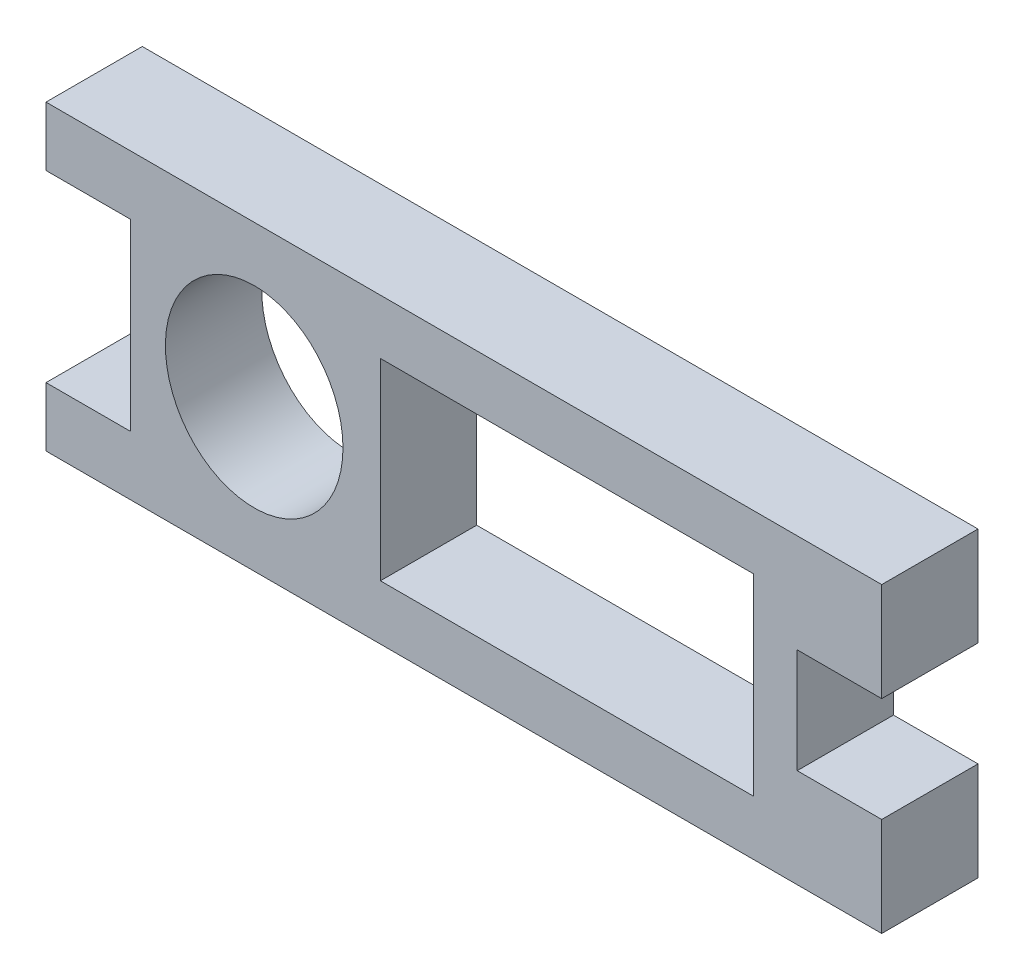
ISO-10303-21;
HEADER;
FILE_DESCRIPTION(('STEP AP214'),'2;1');
FILE_NAME('part.step','',(''),(''),'','','');
FILE_SCHEMA(('AUTOMOTIVE_DESIGN { 1 0 10303 214 1 1 1 1 }'));
ENDSEC;
DATA;
#1=APPLICATION_CONTEXT('core data for automotive mechanical design processes');
#2=APPLICATION_PROTOCOL_DEFINITION('international standard','automotive_design',2000,#1);
#3=PRODUCT_CONTEXT('',#1,'mechanical');
#4=PRODUCT('Part','Part','',(#3));
#5=PRODUCT_RELATED_PRODUCT_CATEGORY('part','',(#4));
#6=PRODUCT_DEFINITION_FORMATION('','',#4);
#7=PRODUCT_DEFINITION_CONTEXT('part definition',#1,'design');
#8=PRODUCT_DEFINITION('design','',#6,#7);
#9=PRODUCT_DEFINITION_SHAPE('','',#8);
#10=(LENGTH_UNIT() NAMED_UNIT(*) SI_UNIT(.MILLI.,.METRE.));
#11=(NAMED_UNIT(*) PLANE_ANGLE_UNIT() SI_UNIT($,.RADIAN.));
#12=(NAMED_UNIT(*) SI_UNIT($,.STERADIAN.) SOLID_ANGLE_UNIT());
#13=UNCERTAINTY_MEASURE_WITH_UNIT(LENGTH_MEASURE(1.E-05),#10,'distance_accuracy_value','');
#14=(GEOMETRIC_REPRESENTATION_CONTEXT(3) GLOBAL_UNCERTAINTY_ASSIGNED_CONTEXT((#13)) GLOBAL_UNIT_ASSIGNED_CONTEXT((#10,
#11,#12)) REPRESENTATION_CONTEXT('',''));
#15=CARTESIAN_POINT('',(0.,0.,0.));
#16=DIRECTION('',(0.,0.,1.));
#17=DIRECTION('',(1.,0.,0.));
#18=AXIS2_PLACEMENT_3D('',#15,#16,#17);
#19=CARTESIAN_POINT('',(4.16215688660487E-12,384.957692719363,5.85));
#20=DIRECTION('',(0.,-1.,0.));
#21=DIRECTION('',(1.,0.,0.));
#22=AXIS2_PLACEMENT_3D('',#19,#20,#21);
#23=PLANE('',#22);
#24=DIRECTION('',(-1.,0.,0.));
#25=VECTOR('',#24,1.);
#26=CARTESIAN_POINT('',(4.16215688660487E-12,384.957692719363,0.));
#27=LINE('',#26,#25);
#28=CARTESIAN_POINT('',(763.043407732568,384.957692719354,0.));
#29=VERTEX_POINT('',#28);
#30=CARTESIAN_POINT('',(757.909183992239,384.957692719354,0.));
#31=VERTEX_POINT('',#30);
#32=EDGE_CURVE('E198',#29,#31,#27,.T.);
#33=ORIENTED_EDGE('',*,*,#32,.T.);
#34=DIRECTION('',(0.,0.,-1.));
#35=VECTOR('',#34,1.);
#36=CARTESIAN_POINT('',(757.909183992239,384.957692719354,5.85));
#37=LINE('',#36,#35);
#38=CARTESIAN_POINT('',(757.909183992239,384.957692719354,5.85));
#39=VERTEX_POINT('',#38);
#40=EDGE_CURVE('E11',#39,#31,#37,.T.);
#41=ORIENTED_EDGE('',*,*,#40,.F.);
#42=DIRECTION('',(-1.,0.,0.));
#43=VECTOR('',#42,1.);
#44=CARTESIAN_POINT('',(4.16215688660487E-12,384.957692719363,5.85));
#45=LINE('',#44,#43);
#46=CARTESIAN_POINT('',(763.043407732568,384.957692719354,5.85));
#47=VERTEX_POINT('',#46);
#48=EDGE_CURVE('E273',#47,#39,#45,.T.);
#49=ORIENTED_EDGE('',*,*,#48,.F.);
#50=DIRECTION('',(0.,0.,-1.));
#51=VECTOR('',#50,1.);
#52=CARTESIAN_POINT('',(763.043407732568,384.957692719354,5.85));
#53=LINE('',#52,#51);
#54=EDGE_CURVE('E228',#47,#29,#53,.T.);
#55=ORIENTED_EDGE('',*,*,#54,.T.);
#56=EDGE_LOOP('',(#33,#41,#49,#55));
#57=FACE_BOUND('',#56,.T.);
#58=ADVANCED_FACE('F35',(#57),#23,.F.);
#59=CARTESIAN_POINT('',(757.909183992239,0.,5.85));
#60=DIRECTION('',(-1.,0.,0.));
#61=DIRECTION('',(0.,0.,1.));
#62=AXIS2_PLACEMENT_3D('',#59,#60,#61);
#63=PLANE('',#62);
#64=DIRECTION('',(0.,1.,0.));
#65=VECTOR('',#64,1.);
#66=CARTESIAN_POINT('',(757.909183992239,0.,0.));
#67=LINE('',#66,#65);
#68=CARTESIAN_POINT('',(757.909183992239,391.315790859354,0.));
#69=VERTEX_POINT('',#68);
#70=EDGE_CURVE('E201',#31,#69,#67,.T.);
#71=ORIENTED_EDGE('',*,*,#70,.T.);
#72=DIRECTION('',(0.,0.,-1.));
#73=VECTOR('',#72,1.);
#74=CARTESIAN_POINT('',(757.909183992239,391.315790859354,5.85));
#75=LINE('',#74,#73);
#76=CARTESIAN_POINT('',(757.909183992239,391.315790859354,5.85));
#77=VERTEX_POINT('',#76);
#78=EDGE_CURVE('E46',#77,#69,#75,.T.);
#79=ORIENTED_EDGE('',*,*,#78,.F.);
#80=DIRECTION('',(0.,1.,0.));
#81=VECTOR('',#80,1.);
#82=CARTESIAN_POINT('',(757.909183992239,0.,5.85));
#83=LINE('',#82,#81);
#84=EDGE_CURVE('E275',#39,#77,#83,.T.);
#85=ORIENTED_EDGE('',*,*,#84,.F.);
#86=ORIENTED_EDGE('',*,*,#40,.T.);
#87=EDGE_LOOP('',(#71,#79,#85,#86));
#88=FACE_BOUND('',#87,.T.);
#89=ADVANCED_FACE('F316',(#88),#63,.F.);
#90=CARTESIAN_POINT('',(0.,391.315790859354,5.85));
#91=DIRECTION('',(0.,-1.,0.));
#92=DIRECTION('',(0.,0.,-1.));
#93=AXIS2_PLACEMENT_3D('',#90,#91,#92);
#94=PLANE('',#93);
#95=DIRECTION('',(-1.,0.,0.));
#96=VECTOR('',#95,1.);
#97=CARTESIAN_POINT('',(0.,391.315790859354,0.));
#98=LINE('',#97,#96);
#99=CARTESIAN_POINT('',(763.043407732568,391.315790859354,0.));
#100=VERTEX_POINT('',#99);
#101=EDGE_CURVE('E204',#100,#69,#98,.T.);
#102=ORIENTED_EDGE('',*,*,#101,.F.);
#103=DIRECTION('',(0.,0.,-1.));
#104=VECTOR('',#103,1.);
#105=CARTESIAN_POINT('',(763.043407732568,391.315790859354,5.85));
#106=LINE('',#105,#104);
#107=CARTESIAN_POINT('',(763.043407732568,391.315790859354,5.85));
#108=VERTEX_POINT('',#107);
#109=EDGE_CURVE('E244',#108,#100,#106,.T.);
#110=ORIENTED_EDGE('',*,*,#109,.F.);
#111=DIRECTION('',(-1.,0.,0.));
#112=VECTOR('',#111,1.);
#113=CARTESIAN_POINT('',(0.,391.315790859354,5.85));
#114=LINE('',#113,#112);
#115=EDGE_CURVE('E281',#108,#77,#114,.T.);
#116=ORIENTED_EDGE('',*,*,#115,.T.);
#117=ORIENTED_EDGE('',*,*,#78,.T.);
#118=EDGE_LOOP('',(#102,#110,#116,#117));
#119=FACE_BOUND('',#118,.T.);
#120=ADVANCED_FACE('F321',(#119),#94,.T.);
#121=CARTESIAN_POINT('',(763.043407732568,0.,5.85));
#122=DIRECTION('',(1.,0.,0.));
#123=DIRECTION('',(0.,0.,-1.));
#124=AXIS2_PLACEMENT_3D('',#121,#122,#123);
#125=PLANE('',#124);
#126=DIRECTION('',(0.,-1.,0.));
#127=VECTOR('',#126,1.);
#128=CARTESIAN_POINT('',(763.043407732568,0.,0.));
#129=LINE('',#128,#127);
#130=CARTESIAN_POINT('',(763.043407732568,397.315790859354,0.));
#131=VERTEX_POINT('',#130);
#132=EDGE_CURVE('E207',#131,#100,#129,.T.);
#133=ORIENTED_EDGE('',*,*,#132,.F.);
#134=DIRECTION('',(0.,0.,-1.));
#135=VECTOR('',#134,1.);
#136=CARTESIAN_POINT('',(763.043407732568,397.315790859354,5.85));
#137=LINE('',#136,#135);
#138=CARTESIAN_POINT('',(763.043407732568,397.315790859354,5.85));
#139=VERTEX_POINT('',#138);
#140=EDGE_CURVE('E242',#139,#131,#137,.T.);
#141=ORIENTED_EDGE('',*,*,#140,.F.);
#142=DIRECTION('',(0.,-1.,0.));
#143=VECTOR('',#142,1.);
#144=CARTESIAN_POINT('',(763.043407732568,0.,5.85));
#145=LINE('',#144,#143);
#146=EDGE_CURVE('E284',#139,#108,#145,.T.);
#147=ORIENTED_EDGE('',*,*,#146,.T.);
#148=ORIENTED_EDGE('',*,*,#109,.T.);
#149=EDGE_LOOP('',(#133,#141,#147,#148));
#150=FACE_BOUND('',#149,.T.);
#151=ADVANCED_FACE('F357',(#150),#125,.T.);
#152=CARTESIAN_POINT('',(0.,397.315790859354,5.85));
#153=DIRECTION('',(0.,-1.,0.));
#154=DIRECTION('',(0.,0.,-1.));
#155=AXIS2_PLACEMENT_3D('',#152,#153,#154);
#156=PLANE('',#155);
#157=DIRECTION('',(-1.,0.,0.));
#158=VECTOR('',#157,1.);
#159=CARTESIAN_POINT('',(0.,397.315790859354,0.));
#160=LINE('',#159,#158);
#161=CARTESIAN_POINT('',(712.27496025191,397.315790859354,0.));
#162=VERTEX_POINT('',#161);
#163=EDGE_CURVE('E210',#131,#162,#160,.T.);
#164=ORIENTED_EDGE('',*,*,#163,.T.);
#165=DIRECTION('',(0.,0.,-1.));
#166=VECTOR('',#165,1.);
#167=CARTESIAN_POINT('',(712.27496025191,397.315790859354,5.85));
#168=LINE('',#167,#166);
#169=CARTESIAN_POINT('',(712.27496025191,397.315790859354,5.85));
#170=VERTEX_POINT('',#169);
#171=EDGE_CURVE('E239',#170,#162,#168,.T.);
#172=ORIENTED_EDGE('',*,*,#171,.F.);
#173=DIRECTION('',(-1.,0.,0.));
#174=VECTOR('',#173,1.);
#175=CARTESIAN_POINT('',(0.,397.315790859354,5.85));
#176=LINE('',#175,#174);
#177=EDGE_CURVE('E287',#139,#170,#176,.T.);
#178=ORIENTED_EDGE('',*,*,#177,.F.);
#179=ORIENTED_EDGE('',*,*,#140,.T.);
#180=EDGE_LOOP('',(#164,#172,#178,#179));
#181=FACE_BOUND('',#180,.T.);
#182=ADVANCED_FACE('F353',(#181),#156,.F.);
#183=CARTESIAN_POINT('',(712.27496025191,0.,5.85));
#184=DIRECTION('',(1.,0.,0.));
#185=DIRECTION('',(0.,0.,-1.));
#186=AXIS2_PLACEMENT_3D('',#183,#184,#185);
#187=PLANE('',#186);
#188=DIRECTION('',(0.,-1.,0.));
#189=VECTOR('',#188,1.);
#190=CARTESIAN_POINT('',(712.27496025191,0.,0.));
#191=LINE('',#190,#189);
#192=CARTESIAN_POINT('',(712.27496025191,393.715790859354,0.));
#193=VERTEX_POINT('',#192);
#194=EDGE_CURVE('E212',#162,#193,#191,.T.);
#195=ORIENTED_EDGE('',*,*,#194,.T.);
#196=DIRECTION('',(0.,0.,-1.));
#197=VECTOR('',#196,1.);
#198=CARTESIAN_POINT('',(712.27496025191,393.715790859354,5.85));
#199=LINE('',#198,#197);
#200=CARTESIAN_POINT('',(712.27496025191,393.715790859354,5.85));
#201=VERTEX_POINT('',#200);
#202=EDGE_CURVE('E236',#201,#193,#199,.T.);
#203=ORIENTED_EDGE('',*,*,#202,.F.);
#204=DIRECTION('',(0.,-1.,0.));
#205=VECTOR('',#204,1.);
#206=CARTESIAN_POINT('',(712.27496025191,0.,5.85));
#207=LINE('',#206,#205);
#208=EDGE_CURVE('E289',#170,#201,#207,.T.);
#209=ORIENTED_EDGE('',*,*,#208,.F.);
#210=ORIENTED_EDGE('',*,*,#171,.T.);
#211=EDGE_LOOP('',(#195,#203,#209,#210));
#212=FACE_BOUND('',#211,.T.);
#213=ADVANCED_FACE('F349',(#212),#187,.F.);
#214=CARTESIAN_POINT('',(4.25684931430896E-12,393.715790859362,5.85));
#215=DIRECTION('',(0.,1.,0.));
#216=DIRECTION('',(-1.,0.,0.));
#217=AXIS2_PLACEMENT_3D('',#214,#215,#216);
#218=PLANE('',#217);
#219=DIRECTION('',(1.,0.,0.));
#220=VECTOR('',#219,1.);
#221=CARTESIAN_POINT('',(4.25684931430896E-12,393.715790859362,0.));
#222=LINE('',#221,#220);
#223=CARTESIAN_POINT('',(717.409183992239,393.715790859354,0.));
#224=VERTEX_POINT('',#223);
#225=EDGE_CURVE('E214',#193,#224,#222,.T.);
#226=ORIENTED_EDGE('',*,*,#225,.T.);
#227=DIRECTION('',(0.,0.,-1.));
#228=VECTOR('',#227,1.);
#229=CARTESIAN_POINT('',(717.409183992239,393.715790859354,5.85));
#230=LINE('',#229,#228);
#231=CARTESIAN_POINT('',(717.409183992239,393.715790859354,5.85));
#232=VERTEX_POINT('',#231);
#233=EDGE_CURVE('E234',#232,#224,#230,.T.);
#234=ORIENTED_EDGE('',*,*,#233,.F.);
#235=DIRECTION('',(1.,0.,0.));
#236=VECTOR('',#235,1.);
#237=CARTESIAN_POINT('',(4.25684931430896E-12,393.715790859362,5.85));
#238=LINE('',#237,#236);
#239=EDGE_CURVE('E291',#201,#232,#238,.T.);
#240=ORIENTED_EDGE('',*,*,#239,.F.);
#241=ORIENTED_EDGE('',*,*,#202,.T.);
#242=EDGE_LOOP('',(#226,#234,#240,#241));
#243=FACE_BOUND('',#242,.T.);
#244=ADVANCED_FACE('F345',(#243),#218,.F.);
#245=CARTESIAN_POINT('',(717.409183992239,0.,5.85));
#246=DIRECTION('',(-1.,0.,0.));
#247=DIRECTION('',(0.,0.,1.));
#248=AXIS2_PLACEMENT_3D('',#245,#246,#247);
#249=PLANE('',#248);
#250=DIRECTION('',(0.,1.,0.));
#251=VECTOR('',#250,1.);
#252=CARTESIAN_POINT('',(717.409183992239,0.,0.));
#253=LINE('',#252,#251);
#254=CARTESIAN_POINT('',(717.409183992239,382.557692719354,0.));
#255=VERTEX_POINT('',#254);
#256=EDGE_CURVE('E217',#255,#224,#253,.T.);
#257=ORIENTED_EDGE('',*,*,#256,.F.);
#258=DIRECTION('',(0.,0.,-1.));
#259=VECTOR('',#258,1.);
#260=CARTESIAN_POINT('',(717.409183992239,382.557692719354,5.85));
#261=LINE('',#260,#259);
#262=CARTESIAN_POINT('',(717.409183992239,382.557692719354,5.85));
#263=VERTEX_POINT('',#262);
#264=EDGE_CURVE('E232',#263,#255,#261,.T.);
#265=ORIENTED_EDGE('',*,*,#264,.F.);
#266=DIRECTION('',(0.,1.,0.));
#267=VECTOR('',#266,1.);
#268=CARTESIAN_POINT('',(717.409183992239,0.,5.85));
#269=LINE('',#268,#267);
#270=EDGE_CURVE('E293',#263,#232,#269,.T.);
#271=ORIENTED_EDGE('',*,*,#270,.T.);
#272=ORIENTED_EDGE('',*,*,#233,.T.);
#273=EDGE_LOOP('',(#257,#265,#271,#272));
#274=FACE_BOUND('',#273,.T.);
#275=ADVANCED_FACE('F342',(#274),#249,.T.);
#276=CARTESIAN_POINT('',(4.13620812206067E-12,382.557692719362,5.85));
#277=DIRECTION('',(0.,1.,0.));
#278=DIRECTION('',(-1.,0.,0.));
#279=AXIS2_PLACEMENT_3D('',#276,#277,#278);
#280=PLANE('',#279);
#281=DIRECTION('',(1.,0.,0.));
#282=VECTOR('',#281,1.);
#283=CARTESIAN_POINT('',(4.13620812206067E-12,382.557692719362,0.));
#284=LINE('',#283,#282);
#285=CARTESIAN_POINT('',(712.27496025191,382.557692719354,0.));
#286=VERTEX_POINT('',#285);
#287=EDGE_CURVE('E220',#286,#255,#284,.T.);
#288=ORIENTED_EDGE('',*,*,#287,.F.);
#289=DIRECTION('',(0.,0.,-1.));
#290=VECTOR('',#289,1.);
#291=CARTESIAN_POINT('',(712.27496025191,382.557692719354,5.85));
#292=LINE('',#291,#290);
#293=CARTESIAN_POINT('',(712.27496025191,382.557692719354,5.85));
#294=VERTEX_POINT('',#293);
#295=EDGE_CURVE('E168',#294,#286,#292,.T.);
#296=ORIENTED_EDGE('',*,*,#295,.F.);
#297=DIRECTION('',(1.,0.,0.));
#298=VECTOR('',#297,1.);
#299=CARTESIAN_POINT('',(4.13620812206067E-12,382.557692719362,5.85));
#300=LINE('',#299,#298);
#301=EDGE_CURVE('E175',#294,#263,#300,.T.);
#302=ORIENTED_EDGE('',*,*,#301,.T.);
#303=ORIENTED_EDGE('',*,*,#264,.T.);
#304=EDGE_LOOP('',(#288,#296,#302,#303));
#305=FACE_BOUND('',#304,.T.);
#306=ADVANCED_FACE('F297',(#305),#280,.T.);
#307=CARTESIAN_POINT('',(712.27496025191,0.,5.85));
#308=DIRECTION('',(-1.,0.,0.));
#309=DIRECTION('',(0.,0.,1.));
#310=AXIS2_PLACEMENT_3D('',#307,#308,#309);
#311=PLANE('',#310);
#312=DIRECTION('',(0.,1.,0.));
#313=VECTOR('',#312,1.);
#314=CARTESIAN_POINT('',(712.27496025191,0.,0.));
#315=LINE('',#314,#313);
#316=CARTESIAN_POINT('',(712.27496025191,378.957692719354,0.));
#317=VERTEX_POINT('',#316);
#318=EDGE_CURVE('E163',#317,#286,#315,.T.);
#319=ORIENTED_EDGE('',*,*,#318,.F.);
#320=DIRECTION('',(0.,0.,-1.));
#321=VECTOR('',#320,1.);
#322=CARTESIAN_POINT('',(712.27496025191,378.957692719354,5.85));
#323=LINE('',#322,#321);
#324=CARTESIAN_POINT('',(712.27496025191,378.957692719354,5.85));
#325=VERTEX_POINT('',#324);
#326=EDGE_CURVE('E158',#325,#317,#323,.T.);
#327=ORIENTED_EDGE('',*,*,#326,.F.);
#328=DIRECTION('',(0.,1.,0.));
#329=VECTOR('',#328,1.);
#330=CARTESIAN_POINT('',(712.27496025191,0.,5.85));
#331=LINE('',#330,#329);
#332=EDGE_CURVE('E161',#325,#294,#331,.T.);
#333=ORIENTED_EDGE('',*,*,#332,.T.);
#334=ORIENTED_EDGE('',*,*,#295,.T.);
#335=EDGE_LOOP('',(#319,#327,#333,#334));
#336=FACE_BOUND('',#335,.T.);
#337=ADVANCED_FACE('F160',(#336),#311,.T.);
#338=CARTESIAN_POINT('',(0.,378.957692719354,5.85));
#339=DIRECTION('',(0.,-1.,0.));
#340=DIRECTION('',(0.,0.,-1.));
#341=AXIS2_PLACEMENT_3D('',#338,#339,#340);
#342=PLANE('',#341);
#343=DIRECTION('',(-1.,0.,0.));
#344=VECTOR('',#343,1.);
#345=CARTESIAN_POINT('',(0.,378.957692719354,0.));
#346=LINE('',#345,#344);
#347=CARTESIAN_POINT('',(763.043407732568,378.957692719354,0.));
#348=VERTEX_POINT('',#347);
#349=EDGE_CURVE('E224',#348,#317,#346,.T.);
#350=ORIENTED_EDGE('',*,*,#349,.F.);
#351=DIRECTION('',(0.,0.,-1.));
#352=VECTOR('',#351,1.);
#353=CARTESIAN_POINT('',(763.043407732568,378.957692719354,5.85));
#354=LINE('',#353,#352);
#355=CARTESIAN_POINT('',(763.043407732568,378.957692719354,5.85));
#356=VERTEX_POINT('',#355);
#357=EDGE_CURVE('E107',#356,#348,#354,.T.);
#358=ORIENTED_EDGE('',*,*,#357,.F.);
#359=DIRECTION('',(-1.,0.,0.));
#360=VECTOR('',#359,1.);
#361=CARTESIAN_POINT('',(0.,378.957692719354,5.85));
#362=LINE('',#361,#360);
#363=EDGE_CURVE('E172',#356,#325,#362,.T.);
#364=ORIENTED_EDGE('',*,*,#363,.T.);
#365=ORIENTED_EDGE('',*,*,#326,.T.);
#366=EDGE_LOOP('',(#350,#358,#364,#365));
#367=FACE_BOUND('',#366,.T.);
#368=ADVANCED_FACE('F177',(#367),#342,.T.);
#369=CARTESIAN_POINT('',(0.,393.986741789354,5.85));
#370=DIRECTION('',(0.,-1.,0.));
#371=DIRECTION('',(0.,0.,-1.));
#372=AXIS2_PLACEMENT_3D('',#369,#370,#371);
#373=PLANE('',#372);
#374=DIRECTION('',(-1.,0.,0.));
#375=VECTOR('',#374,1.);
#376=CARTESIAN_POINT('',(0.,393.986741789354,0.));
#377=LINE('',#376,#375);
#378=CARTESIAN_POINT('',(755.25918699191,393.986741789354,0.));
#379=VERTEX_POINT('',#378);
#380=CARTESIAN_POINT('',(732.58969574191,393.986741789354,0.));
#381=VERTEX_POINT('',#380);
#382=EDGE_CURVE('E186',#379,#381,#377,.T.);
#383=ORIENTED_EDGE('',*,*,#382,.F.);
#384=DIRECTION('',(0.,0.,-1.));
#385=VECTOR('',#384,1.);
#386=CARTESIAN_POINT('',(755.25918699191,393.986741789354,5.85));
#387=LINE('',#386,#385);
#388=CARTESIAN_POINT('',(755.25918699191,393.986741789354,5.85));
#389=VERTEX_POINT('',#388);
#390=EDGE_CURVE('E40',#389,#379,#387,.T.);
#391=ORIENTED_EDGE('',*,*,#390,.F.);
#392=DIRECTION('',(-1.,0.,0.));
#393=VECTOR('',#392,1.);
#394=CARTESIAN_POINT('',(0.,393.986741789354,5.85));
#395=LINE('',#394,#393);
#396=CARTESIAN_POINT('',(732.58969574191,393.986741789354,5.85));
#397=VERTEX_POINT('',#396);
#398=EDGE_CURVE('E507',#389,#397,#395,.T.);
#399=ORIENTED_EDGE('',*,*,#398,.T.);
#400=DIRECTION('',(0.,0.,-1.));
#401=VECTOR('',#400,1.);
#402=CARTESIAN_POINT('',(732.58969574191,393.986741789354,5.85));
#403=LINE('',#402,#401);
#404=EDGE_CURVE('E179',#397,#381,#403,.T.);
#405=ORIENTED_EDGE('',*,*,#404,.T.);
#406=EDGE_LOOP('',(#383,#391,#399,#405));
#407=FACE_BOUND('',#406,.T.);
#408=ADVANCED_FACE('F259',(#407),#373,.T.);
#409=CARTESIAN_POINT('',(755.25918699191,0.,5.85));
#410=DIRECTION('',(-1.,0.,0.));
#411=DIRECTION('',(0.,0.,1.));
#412=AXIS2_PLACEMENT_3D('',#409,#410,#411);
#413=PLANE('',#412);
#414=DIRECTION('',(0.,1.,0.));
#415=VECTOR('',#414,1.);
#416=CARTESIAN_POINT('',(755.25918699191,0.,0.));
#417=LINE('',#416,#415);
#418=CARTESIAN_POINT('',(755.25918699191,382.286741789354,0.));
#419=VERTEX_POINT('',#418);
#420=EDGE_CURVE('E189',#419,#379,#417,.T.);
#421=ORIENTED_EDGE('',*,*,#420,.F.);
#422=DIRECTION('',(0.,0.,-1.));
#423=VECTOR('',#422,1.);
#424=CARTESIAN_POINT('',(755.25918699191,382.286741789354,5.85));
#425=LINE('',#424,#423);
#426=CARTESIAN_POINT('',(755.25918699191,382.286741789354,5.85));
#427=VERTEX_POINT('',#426);
#428=EDGE_CURVE('E249',#427,#419,#425,.T.);
#429=ORIENTED_EDGE('',*,*,#428,.F.);
#430=DIRECTION('',(0.,1.,0.));
#431=VECTOR('',#430,1.);
#432=CARTESIAN_POINT('',(755.25918699191,0.,5.85));
#433=LINE('',#432,#431);
#434=EDGE_CURVE('E258',#427,#389,#433,.T.);
#435=ORIENTED_EDGE('',*,*,#434,.T.);
#436=ORIENTED_EDGE('',*,*,#390,.T.);
#437=EDGE_LOOP('',(#421,#429,#435,#436));
#438=FACE_BOUND('',#437,.T.);
#439=ADVANCED_FACE('F256',(#438),#413,.T.);
#440=CARTESIAN_POINT('',(1.24100451094584E-12,382.286741789357,5.85));
#441=DIRECTION('',(0.,-1.,0.));
#442=DIRECTION('',(1.,0.,0.));
#443=AXIS2_PLACEMENT_3D('',#440,#441,#442);
#444=PLANE('',#443);
#445=DIRECTION('',(-1.,0.,0.));
#446=VECTOR('',#445,1.);
#447=CARTESIAN_POINT('',(1.24100451094584E-12,382.286741789357,0.));
#448=LINE('',#447,#446);
#449=CARTESIAN_POINT('',(732.58969574191,382.286741789354,0.));
#450=VERTEX_POINT('',#449);
#451=EDGE_CURVE('E192',#419,#450,#448,.T.);
#452=ORIENTED_EDGE('',*,*,#451,.T.);
#453=DIRECTION('',(0.,0.,-1.));
#454=VECTOR('',#453,1.);
#455=CARTESIAN_POINT('',(732.58969574191,382.286741789354,5.85));
#456=LINE('',#455,#454);
#457=CARTESIAN_POINT('',(732.58969574191,382.286741789354,5.85));
#458=VERTEX_POINT('',#457);
#459=EDGE_CURVE('E248',#458,#450,#456,.T.);
#460=ORIENTED_EDGE('',*,*,#459,.F.);
#461=DIRECTION('',(-1.,0.,0.));
#462=VECTOR('',#461,1.);
#463=CARTESIAN_POINT('',(1.24100451094584E-12,382.286741789357,5.85));
#464=LINE('',#463,#462);
#465=EDGE_CURVE('E267',#427,#458,#464,.T.);
#466=ORIENTED_EDGE('',*,*,#465,.F.);
#467=ORIENTED_EDGE('',*,*,#428,.T.);
#468=EDGE_LOOP('',(#452,#460,#466,#467));
#469=FACE_BOUND('',#468,.T.);
#470=ADVANCED_FACE('F265',(#469),#444,.F.);
#471=CARTESIAN_POINT('',(732.58969574191,0.,5.85));
#472=DIRECTION('',(1.,0.,0.));
#473=DIRECTION('',(0.,0.,-1.));
#474=AXIS2_PLACEMENT_3D('',#471,#472,#473);
#475=PLANE('',#474);
#476=DIRECTION('',(0.,-1.,0.));
#477=VECTOR('',#476,1.);
#478=CARTESIAN_POINT('',(732.58969574191,0.,0.));
#479=LINE('',#478,#477);
#480=EDGE_CURVE('E195',#381,#450,#479,.T.);
#481=ORIENTED_EDGE('',*,*,#480,.F.);
#482=ORIENTED_EDGE('',*,*,#404,.F.);
#483=DIRECTION('',(0.,-1.,0.));
#484=VECTOR('',#483,1.);
#485=CARTESIAN_POINT('',(732.58969574191,0.,5.85));
#486=LINE('',#485,#484);
#487=EDGE_CURVE('E270',#397,#458,#486,.T.);
#488=ORIENTED_EDGE('',*,*,#487,.T.);
#489=ORIENTED_EDGE('',*,*,#459,.T.);
#490=EDGE_LOOP('',(#481,#482,#488,#489));
#491=FACE_BOUND('',#490,.T.);
#492=ADVANCED_FACE('F271',(#491),#475,.T.);
#493=CARTESIAN_POINT('',(724.922370371104,388.136741789354,5.85));
#494=DIRECTION('',(0.,0.,1.));
#495=DIRECTION('',(0.,1.,0.));
#496=AXIS2_PLACEMENT_3D('',#493,#494,#495);
#497=ELLIPSE('',#496,5.84999999999991,5.39355322251489);
#498=DIRECTION('',(0.,0.,-1.));
#499=VECTOR('',#498,1.);
#500=SURFACE_OF_LINEAR_EXTRUSION('',#497,#499);
#501=CARTESIAN_POINT('',(724.922370371104,393.986741789354,5.85));
#502=VERTEX_POINT('',#501);
#503=EDGE_CURVE('E227',#502,#502,#497,.T.);
#504=ORIENTED_EDGE('',*,*,#503,.T.);
#505=EDGE_LOOP('',(#504));
#506=FACE_BOUND('',#505,.T.);
#507=CARTESIAN_POINT('',(724.922370371104,388.136741789354,0.));
#508=DIRECTION('',(0.,0.,1.));
#509=DIRECTION('',(0.,1.,0.));
#510=AXIS2_PLACEMENT_3D('',#507,#508,#509);
#511=ELLIPSE('',#510,5.84999999999991,5.39355322251489);
#512=CARTESIAN_POINT('',(724.922370371104,393.986741789354,0.));
#513=VERTEX_POINT('',#512);
#514=EDGE_CURVE('E183',#513,#513,#511,.T.);
#515=ORIENTED_EDGE('',*,*,#514,.F.);
#516=EDGE_LOOP('',(#515));
#517=FACE_BOUND('',#516,.T.);
#518=ADVANCED_FACE('F37',(#506,#517),#500,.T.);
#519=CARTESIAN_POINT('',(763.043407732568,0.,5.85));
#520=DIRECTION('',(-1.,0.,0.));
#521=DIRECTION('',(0.,0.,1.));
#522=AXIS2_PLACEMENT_3D('',#519,#520,#521);
#523=PLANE('',#522);
#524=DIRECTION('',(0.,1.,0.));
#525=VECTOR('',#524,1.);
#526=CARTESIAN_POINT('',(763.043407732568,0.,0.));
#527=LINE('',#526,#525);
#528=EDGE_CURVE('E110',#348,#29,#527,.T.);
#529=ORIENTED_EDGE('',*,*,#528,.T.);
#530=ORIENTED_EDGE('',*,*,#54,.F.);
#531=DIRECTION('',(0.,1.,0.));
#532=VECTOR('',#531,1.);
#533=CARTESIAN_POINT('',(763.043407732568,0.,5.85));
#534=LINE('',#533,#532);
#535=EDGE_CURVE('E55',#356,#47,#534,.T.);
#536=ORIENTED_EDGE('',*,*,#535,.F.);
#537=ORIENTED_EDGE('',*,*,#357,.T.);
#538=EDGE_LOOP('',(#529,#530,#536,#537));
#539=FACE_BOUND('',#538,.T.);
#540=ADVANCED_FACE('F303',(#539),#523,.F.);
#541=CARTESIAN_POINT('',(0.,0.,5.85));
#542=DIRECTION('',(0.,0.,1.));
#543=DIRECTION('',(1.,0.,0.));
#544=AXIS2_PLACEMENT_3D('',#541,#542,#543);
#545=PLANE('',#544);
#546=ORIENTED_EDGE('',*,*,#503,.F.);
#547=EDGE_LOOP('',(#546));
#548=FACE_BOUND('',#547,.T.);
#549=ORIENTED_EDGE('',*,*,#398,.F.);
#550=ORIENTED_EDGE('',*,*,#434,.F.);
#551=ORIENTED_EDGE('',*,*,#465,.T.);
#552=ORIENTED_EDGE('',*,*,#487,.F.);
#553=EDGE_LOOP('',(#549,#550,#551,#552));
#554=FACE_BOUND('',#553,.T.);
#555=ORIENTED_EDGE('',*,*,#48,.T.);
#556=ORIENTED_EDGE('',*,*,#84,.T.);
#557=ORIENTED_EDGE('',*,*,#115,.F.);
#558=ORIENTED_EDGE('',*,*,#146,.F.);
#559=ORIENTED_EDGE('',*,*,#177,.T.);
#560=ORIENTED_EDGE('',*,*,#208,.T.);
#561=ORIENTED_EDGE('',*,*,#239,.T.);
#562=ORIENTED_EDGE('',*,*,#270,.F.);
#563=ORIENTED_EDGE('',*,*,#301,.F.);
#564=ORIENTED_EDGE('',*,*,#332,.F.);
#565=ORIENTED_EDGE('',*,*,#363,.F.);
#566=ORIENTED_EDGE('',*,*,#535,.T.);
#567=EDGE_LOOP('',(#555,#556,#557,#558,#559,#560,#561,#562,#563,#564,#565,#566));
#568=FACE_BOUND('',#567,.T.);
#569=ADVANCED_FACE('F171',(#548,#554,#568),#545,.T.);
#570=CARTESIAN_POINT('',(0.,0.,0.));
#571=DIRECTION('',(0.,0.,1.));
#572=DIRECTION('',(1.,0.,0.));
#573=AXIS2_PLACEMENT_3D('',#570,#571,#572);
#574=PLANE('',#573);
#575=ORIENTED_EDGE('',*,*,#514,.T.);
#576=EDGE_LOOP('',(#575));
#577=FACE_BOUND('',#576,.T.);
#578=ORIENTED_EDGE('',*,*,#382,.T.);
#579=ORIENTED_EDGE('',*,*,#480,.T.);
#580=ORIENTED_EDGE('',*,*,#451,.F.);
#581=ORIENTED_EDGE('',*,*,#420,.T.);
#582=EDGE_LOOP('',(#578,#579,#580,#581));
#583=FACE_BOUND('',#582,.T.);
#584=ORIENTED_EDGE('',*,*,#32,.F.);
#585=ORIENTED_EDGE('',*,*,#528,.F.);
#586=ORIENTED_EDGE('',*,*,#349,.T.);
#587=ORIENTED_EDGE('',*,*,#318,.T.);
#588=ORIENTED_EDGE('',*,*,#287,.T.);
#589=ORIENTED_EDGE('',*,*,#256,.T.);
#590=ORIENTED_EDGE('',*,*,#225,.F.);
#591=ORIENTED_EDGE('',*,*,#194,.F.);
#592=ORIENTED_EDGE('',*,*,#163,.F.);
#593=ORIENTED_EDGE('',*,*,#132,.T.);
#594=ORIENTED_EDGE('',*,*,#101,.T.);
#595=ORIENTED_EDGE('',*,*,#70,.F.);
#596=EDGE_LOOP('',(#584,#585,#586,#587,#588,#589,#590,#591,#592,#593,#594,#595));
#597=FACE_BOUND('',#596,.T.);
#598=ADVANCED_FACE('F262',(#577,#583,#597),#574,.F.);
#599=CLOSED_SHELL('',(#58,#89,#120,#151,#182,#213,#244,#275,#306,#337,#368,#408,#439,#470,#492,
#518,#540,#569,#598));
#600=MANIFOLD_SOLID_BREP('B2',#599);
#601=ADVANCED_BREP_SHAPE_REPRESENTATION('',(#18,#600),#14);
#602=SHAPE_DEFINITION_REPRESENTATION(#9,#601);
ENDSEC;
END-ISO-10303-21;
